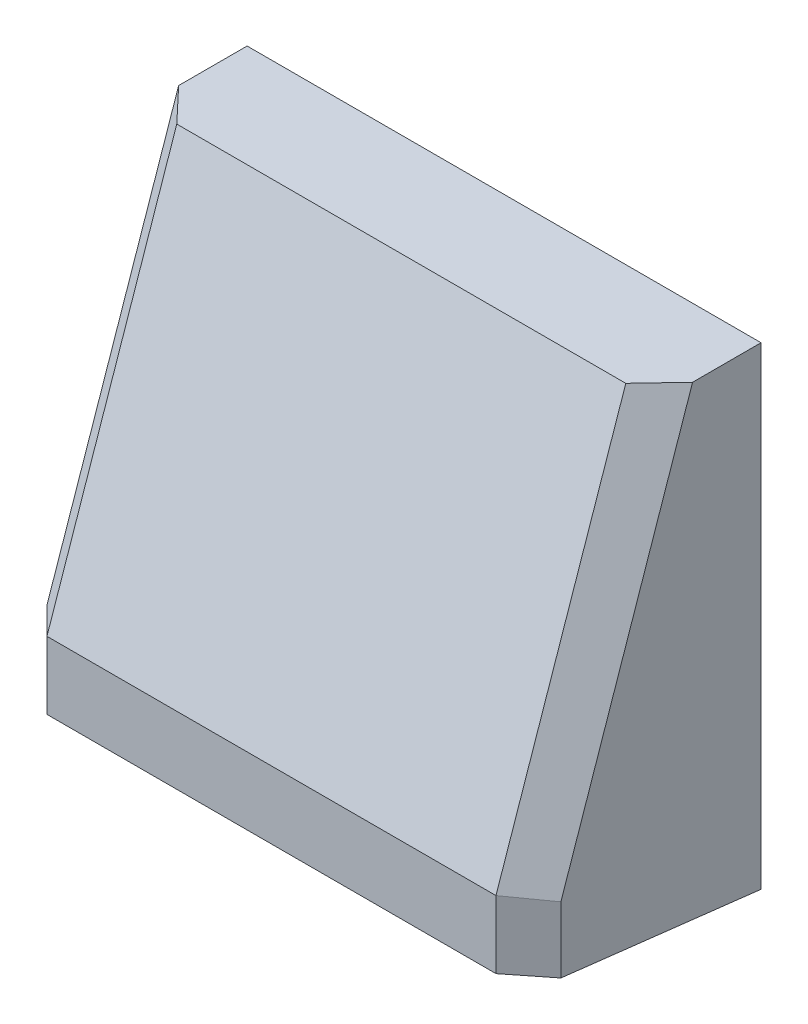
ISO-10303-21;
HEADER;
FILE_DESCRIPTION(('STEP AP214'),'2;1');
FILE_NAME('part.step','',(''),(''),'','','');
FILE_SCHEMA(('AUTOMOTIVE_DESIGN { 1 0 10303 214 1 1 1 1 }'));
ENDSEC;
DATA;
#1=APPLICATION_CONTEXT('core data for automotive mechanical design processes');
#2=APPLICATION_PROTOCOL_DEFINITION('international standard','automotive_design',2000,#1);
#3=PRODUCT_CONTEXT('',#1,'mechanical');
#4=PRODUCT('Part','Part','',(#3));
#5=PRODUCT_RELATED_PRODUCT_CATEGORY('part','',(#4));
#6=PRODUCT_DEFINITION_FORMATION('','',#4);
#7=PRODUCT_DEFINITION_CONTEXT('part definition',#1,'design');
#8=PRODUCT_DEFINITION('design','',#6,#7);
#9=PRODUCT_DEFINITION_SHAPE('','',#8);
#10=(LENGTH_UNIT() NAMED_UNIT(*) SI_UNIT(.MILLI.,.METRE.));
#11=(NAMED_UNIT(*) PLANE_ANGLE_UNIT() SI_UNIT($,.RADIAN.));
#12=(NAMED_UNIT(*) SI_UNIT($,.STERADIAN.) SOLID_ANGLE_UNIT());
#13=UNCERTAINTY_MEASURE_WITH_UNIT(LENGTH_MEASURE(1.E-05),#10,'distance_accuracy_value','');
#14=(GEOMETRIC_REPRESENTATION_CONTEXT(3) GLOBAL_UNCERTAINTY_ASSIGNED_CONTEXT((#13)) GLOBAL_UNIT_ASSIGNED_CONTEXT((#10,
#11,#12)) REPRESENTATION_CONTEXT('',''));
#15=CARTESIAN_POINT('',(0.,0.,0.));
#16=DIRECTION('',(0.,0.,1.));
#17=DIRECTION('',(1.,0.,0.));
#18=AXIS2_PLACEMENT_3D('',#15,#16,#17);
#19=CARTESIAN_POINT('',(-95.,35.,108.));
#20=DIRECTION('',(0.,-0.993307380301254,0.115500858174564));
#21=DIRECTION('',(0.,-0.115500858174564,-0.993307380301254));
#22=AXIS2_PLACEMENT_3D('',#19,#20,#21);
#23=PLANE('',#22);
#24=DIRECTION('',(0.,-0.115500858174564,-0.993307380301253));
#25=VECTOR('',#24,1.);
#26=CARTESIAN_POINT('',(95.,35.,108.));
#27=LINE('',#26,#25);
#28=CARTESIAN_POINT('',(95.,33.6046511627907,96.));
#29=VERTEX_POINT('',#28);
#30=CARTESIAN_POINT('',(95.,25.,22.));
#31=VERTEX_POINT('',#30);
#32=EDGE_CURVE('E179',#29,#31,#27,.T.);
#33=ORIENTED_EDGE('',*,*,#32,.F.);
#34=DIRECTION('',(0.704728665951292,-0.0819451937152659,-0.704728665951287));
#35=VECTOR('',#34,1.);
#36=CARTESIAN_POINT('',(-5.40236368520074,45.2793446145582,196.4023636852));
#37=LINE('',#36,#35);
#38=CARTESIAN_POINT('',(83.,35.,108.));
#39=VERTEX_POINT('',#38);
#40=EDGE_CURVE('E231',#29,#39,#37,.F.);
#41=ORIENTED_EDGE('',*,*,#40,.T.);
#42=DIRECTION('',(1.,0.,0.));
#43=VECTOR('',#42,1.);
#44=CARTESIAN_POINT('',(-95.,35.,108.));
#45=LINE('',#44,#43);
#46=CARTESIAN_POINT('',(-83.,35.,108.));
#47=VERTEX_POINT('',#46);
#48=EDGE_CURVE('E197',#47,#39,#45,.T.);
#49=ORIENTED_EDGE('',*,*,#48,.F.);
#50=DIRECTION('',(-0.704728665951287,-0.0819451937152665,-0.704728665951292));
#51=VECTOR('',#50,1.);
#52=CARTESIAN_POINT('',(-88.9597099113618,34.3070104754231,102.040290088638));
#53=LINE('',#52,#51);
#54=CARTESIAN_POINT('',(-95.,33.6046511627907,96.));
#55=VERTEX_POINT('',#54);
#56=EDGE_CURVE('E63',#47,#55,#53,.T.);
#57=ORIENTED_EDGE('',*,*,#56,.T.);
#58=DIRECTION('',(0.,-0.115500858174564,-0.993307380301253));
#59=VECTOR('',#58,1.);
#60=CARTESIAN_POINT('',(-95.,35.,108.));
#61=LINE('',#60,#59);
#62=CARTESIAN_POINT('',(-95.,25.,22.));
#63=VERTEX_POINT('',#62);
#64=EDGE_CURVE('E189',#55,#63,#61,.T.);
#65=ORIENTED_EDGE('',*,*,#64,.T.);
#66=DIRECTION('',(1.,0.,0.));
#67=VECTOR('',#66,1.);
#68=CARTESIAN_POINT('',(-95.,25.,22.));
#69=LINE('',#68,#67);
#70=CARTESIAN_POINT('',(-80.,25.,22.));
#71=VERTEX_POINT('',#70);
#72=EDGE_CURVE('E208',#63,#71,#69,.T.);
#73=ORIENTED_EDGE('',*,*,#72,.T.);
#74=DIRECTION('',(0.,0.115500858174564,0.993307380301254));
#75=VECTOR('',#74,1.);
#76=CARTESIAN_POINT('',(-80.,35.,108.));
#77=LINE('',#76,#75);
#78=CARTESIAN_POINT('',(-80.,33.6046511627907,96.));
#79=VERTEX_POINT('',#78);
#80=EDGE_CURVE('E158',#71,#79,#77,.T.);
#81=ORIENTED_EDGE('',*,*,#80,.T.);
#82=DIRECTION('',(-1.,0.,0.));
#83=VECTOR('',#82,1.);
#84=CARTESIAN_POINT('',(80.,33.6046511627907,96.));
#85=LINE('',#84,#83);
#86=CARTESIAN_POINT('',(80.,33.6046511627907,96.));
#87=VERTEX_POINT('',#86);
#88=EDGE_CURVE('E174',#87,#79,#85,.T.);
#89=ORIENTED_EDGE('',*,*,#88,.F.);
#90=DIRECTION('',(0.,0.115500858174564,0.993307380301254));
#91=VECTOR('',#90,1.);
#92=CARTESIAN_POINT('',(80.,35.,108.));
#93=LINE('',#92,#91);
#94=CARTESIAN_POINT('',(80.,25.,22.));
#95=VERTEX_POINT('',#94);
#96=EDGE_CURVE('E178',#95,#87,#93,.T.);
#97=ORIENTED_EDGE('',*,*,#96,.F.);
#98=EDGE_CURVE('E198',#95,#31,#69,.T.);
#99=ORIENTED_EDGE('',*,*,#98,.T.);
#100=EDGE_LOOP('',(#33,#41,#49,#57,#65,#73,#81,#89,#97,#99));
#101=FACE_BOUND('',#100,.T.);
#102=ADVANCED_FACE('F41',(#101),#23,.T.);
#103=CARTESIAN_POINT('',(-95.,60.,108.));
#104=DIRECTION('',(0.,0.,1.));
#105=DIRECTION('',(1.,0.,0.));
#106=AXIS2_PLACEMENT_3D('',#103,#104,#105);
#107=PLANE('',#106);
#108=ORIENTED_EDGE('',*,*,#48,.T.);
#109=DIRECTION('',(0.,1.,0.));
#110=VECTOR('',#109,1.);
#111=CARTESIAN_POINT('',(83.,60.,108.));
#112=LINE('',#111,#110);
#113=CARTESIAN_POINT('',(83.,60.,108.));
#114=VERTEX_POINT('',#113);
#115=EDGE_CURVE('E234',#39,#114,#112,.T.);
#116=ORIENTED_EDGE('',*,*,#115,.T.);
#117=DIRECTION('',(1.,0.,0.));
#118=VECTOR('',#117,1.);
#119=CARTESIAN_POINT('',(-95.,60.,108.));
#120=LINE('',#119,#118);
#121=CARTESIAN_POINT('',(-83.,60.,108.));
#122=VERTEX_POINT('',#121);
#123=EDGE_CURVE('E199',#122,#114,#120,.T.);
#124=ORIENTED_EDGE('',*,*,#123,.F.);
#125=DIRECTION('',(0.,-1.,0.));
#126=VECTOR('',#125,1.);
#127=CARTESIAN_POINT('',(-83.,35.,108.));
#128=LINE('',#127,#126);
#129=EDGE_CURVE('E233',#122,#47,#128,.T.);
#130=ORIENTED_EDGE('',*,*,#129,.T.);
#131=EDGE_LOOP('',(#108,#116,#124,#130));
#132=FACE_BOUND('',#131,.T.);
#133=ADVANCED_FACE('F255',(#132),#107,.T.);
#134=CARTESIAN_POINT('',(-95.,200.,60.));
#135=DIRECTION('',(0.,0.324324324324324,0.945945945945946));
#136=DIRECTION('',(0.,-0.945945945945946,0.324324324324324));
#137=AXIS2_PLACEMENT_3D('',#134,#135,#136);
#138=PLANE('',#137);
#139=ORIENTED_EDGE('',*,*,#123,.T.);
#140=DIRECTION('',(0.,0.945945945945946,-0.324324324324324));
#141=VECTOR('',#140,1.);
#142=CARTESIAN_POINT('',(83.,200.,60.));
#143=LINE('',#142,#141);
#144=CARTESIAN_POINT('',(83.,200.,60.));
#145=VERTEX_POINT('',#144);
#146=EDGE_CURVE('E221',#114,#145,#143,.T.);
#147=ORIENTED_EDGE('',*,*,#146,.T.);
#148=DIRECTION('',(1.,0.,0.));
#149=VECTOR('',#148,1.);
#150=CARTESIAN_POINT('',(-95.,200.,60.));
#151=LINE('',#150,#149);
#152=CARTESIAN_POINT('',(-83.,200.,60.));
#153=VERTEX_POINT('',#152);
#154=EDGE_CURVE('E201',#153,#145,#151,.T.);
#155=ORIENTED_EDGE('',*,*,#154,.F.);
#156=DIRECTION('',(0.,-0.945945945945946,0.324324324324324));
#157=VECTOR('',#156,1.);
#158=CARTESIAN_POINT('',(-83.,60.,108.));
#159=LINE('',#158,#157);
#160=EDGE_CURVE('E222',#153,#122,#159,.T.);
#161=ORIENTED_EDGE('',*,*,#160,.T.);
#162=EDGE_LOOP('',(#139,#147,#155,#161));
#163=FACE_BOUND('',#162,.T.);
#164=ADVANCED_FACE('F251',(#163),#138,.T.);
#165=CARTESIAN_POINT('',(-95.,200.,22.));
#166=DIRECTION('',(0.,1.,0.));
#167=DIRECTION('',(0.,0.,1.));
#168=AXIS2_PLACEMENT_3D('',#165,#166,#167);
#169=PLANE('',#168);
#170=ORIENTED_EDGE('',*,*,#154,.T.);
#171=DIRECTION('',(-0.687199853876086,0.,0.726468416954713));
#172=VECTOR('',#171,1.);
#173=CARTESIAN_POINT('',(17.9113338473393,200.,128.808018504241));
#174=LINE('',#173,#172);
#175=CARTESIAN_POINT('',(95.,200.,47.3142857142858));
#176=VERTEX_POINT('',#175);
#177=EDGE_CURVE('E229',#145,#176,#174,.F.);
#178=ORIENTED_EDGE('',*,*,#177,.T.);
#179=DIRECTION('',(0.,0.,1.));
#180=VECTOR('',#179,1.);
#181=CARTESIAN_POINT('',(95.,200.,22.));
#182=LINE('',#181,#180);
#183=CARTESIAN_POINT('',(95.,200.,22.));
#184=VERTEX_POINT('',#183);
#185=EDGE_CURVE('E183',#184,#176,#182,.T.);
#186=ORIENTED_EDGE('',*,*,#185,.F.);
#187=DIRECTION('',(1.,0.,0.));
#188=VECTOR('',#187,1.);
#189=CARTESIAN_POINT('',(-95.,200.,22.));
#190=LINE('',#189,#188);
#191=CARTESIAN_POINT('',(-95.,200.,22.));
#192=VERTEX_POINT('',#191);
#193=EDGE_CURVE('E206',#192,#184,#190,.T.);
#194=ORIENTED_EDGE('',*,*,#193,.F.);
#195=DIRECTION('',(0.,0.,1.));
#196=VECTOR('',#195,1.);
#197=CARTESIAN_POINT('',(-95.,200.,22.));
#198=LINE('',#197,#196);
#199=CARTESIAN_POINT('',(-95.,200.,47.3142857142857));
#200=VERTEX_POINT('',#199);
#201=EDGE_CURVE('E193',#192,#200,#198,.T.);
#202=ORIENTED_EDGE('',*,*,#201,.T.);
#203=DIRECTION('',(0.68719985387608,0.,0.726468416954718));
#204=VECTOR('',#203,1.);
#205=CARTESIAN_POINT('',(-107.637625289129,200.,33.9545104086352));
#206=LINE('',#205,#204);
#207=EDGE_CURVE('E227',#200,#153,#206,.T.);
#208=ORIENTED_EDGE('',*,*,#207,.T.);
#209=EDGE_LOOP('',(#170,#178,#186,#194,#202,#208));
#210=FACE_BOUND('',#209,.T.);
#211=ADVANCED_FACE('F266',(#210),#169,.T.);
#212=CARTESIAN_POINT('',(-95.,25.,22.));
#213=DIRECTION('',(0.,0.,-1.));
#214=DIRECTION('',(-1.,0.,0.));
#215=AXIS2_PLACEMENT_3D('',#212,#213,#214);
#216=PLANE('',#215);
#217=DIRECTION('',(0.,-1.,0.));
#218=VECTOR('',#217,1.);
#219=CARTESIAN_POINT('',(80.,25.,22.));
#220=LINE('',#219,#218);
#221=CARTESIAN_POINT('',(80.,193.,22.));
#222=VERTEX_POINT('',#221);
#223=EDGE_CURVE('E212',#222,#95,#220,.T.);
#224=ORIENTED_EDGE('',*,*,#223,.F.);
#225=DIRECTION('',(-1.,0.,0.));
#226=VECTOR('',#225,1.);
#227=CARTESIAN_POINT('',(-95.,193.,22.));
#228=LINE('',#227,#226);
#229=CARTESIAN_POINT('',(-80.,193.,22.));
#230=VERTEX_POINT('',#229);
#231=EDGE_CURVE('E215',#222,#230,#228,.T.);
#232=ORIENTED_EDGE('',*,*,#231,.T.);
#233=DIRECTION('',(0.,-1.,0.));
#234=VECTOR('',#233,1.);
#235=CARTESIAN_POINT('',(-80.,25.,22.));
#236=LINE('',#235,#234);
#237=EDGE_CURVE('E148',#230,#71,#236,.T.);
#238=ORIENTED_EDGE('',*,*,#237,.T.);
#239=ORIENTED_EDGE('',*,*,#72,.F.);
#240=DIRECTION('',(0.,1.,0.));
#241=VECTOR('',#240,1.);
#242=CARTESIAN_POINT('',(-95.,25.,22.));
#243=LINE('',#242,#241);
#244=EDGE_CURVE('E188',#63,#192,#243,.T.);
#245=ORIENTED_EDGE('',*,*,#244,.T.);
#246=ORIENTED_EDGE('',*,*,#193,.T.);
#247=DIRECTION('',(0.,1.,0.));
#248=VECTOR('',#247,1.);
#249=CARTESIAN_POINT('',(95.,25.,22.));
#250=LINE('',#249,#248);
#251=EDGE_CURVE('E185',#31,#184,#250,.T.);
#252=ORIENTED_EDGE('',*,*,#251,.F.);
#253=ORIENTED_EDGE('',*,*,#98,.F.);
#254=EDGE_LOOP('',(#224,#232,#238,#239,#245,#246,#252,#253));
#255=FACE_BOUND('',#254,.T.);
#256=ADVANCED_FACE('F272',(#255),#216,.T.);
#257=CARTESIAN_POINT('',(-95.,0.,0.));
#258=DIRECTION('',(1.,0.,0.));
#259=DIRECTION('',(0.,0.,-1.));
#260=AXIS2_PLACEMENT_3D('',#257,#258,#259);
#261=PLANE('',#260);
#262=DIRECTION('',(0.,1.,0.));
#263=VECTOR('',#262,1.);
#264=CARTESIAN_POINT('',(-95.,60.,96.));
#265=LINE('',#264,#263);
#266=CARTESIAN_POINT('',(-95.,58.,96.));
#267=VERTEX_POINT('',#266);
#268=EDGE_CURVE('E51',#55,#267,#265,.T.);
#269=ORIENTED_EDGE('',*,*,#268,.T.);
#270=DIRECTION('',(0.,0.945945945945946,-0.324324324324324));
#271=VECTOR('',#270,1.);
#272=CARTESIAN_POINT('',(-95.,196.108108108108,48.6486486486486));
#273=LINE('',#272,#271);
#274=EDGE_CURVE('E11',#267,#200,#273,.T.);
#275=ORIENTED_EDGE('',*,*,#274,.T.);
#276=ORIENTED_EDGE('',*,*,#201,.F.);
#277=ORIENTED_EDGE('',*,*,#244,.F.);
#278=ORIENTED_EDGE('',*,*,#64,.F.);
#279=EDGE_LOOP('',(#269,#275,#276,#277,#278));
#280=FACE_BOUND('',#279,.T.);
#281=ADVANCED_FACE('F267',(#280),#261,.F.);
#282=CARTESIAN_POINT('',(95.,0.,0.));
#283=DIRECTION('',(1.,0.,0.));
#284=DIRECTION('',(0.,0.,-1.));
#285=AXIS2_PLACEMENT_3D('',#282,#283,#284);
#286=PLANE('',#285);
#287=ORIENTED_EDGE('',*,*,#185,.T.);
#288=DIRECTION('',(0.,-0.945945945945946,0.324324324324324));
#289=VECTOR('',#288,1.);
#290=CARTESIAN_POINT('',(95.,35.5529583637692,103.696128560993));
#291=LINE('',#290,#289);
#292=CARTESIAN_POINT('',(95.,58.0000000000001,96.));
#293=VERTEX_POINT('',#292);
#294=EDGE_CURVE('E217',#176,#293,#291,.T.);
#295=ORIENTED_EDGE('',*,*,#294,.T.);
#296=DIRECTION('',(0.,-1.,0.));
#297=VECTOR('',#296,1.);
#298=CARTESIAN_POINT('',(95.,0.,96.));
#299=LINE('',#298,#297);
#300=EDGE_CURVE('E216',#293,#29,#299,.T.);
#301=ORIENTED_EDGE('',*,*,#300,.T.);
#302=ORIENTED_EDGE('',*,*,#32,.T.);
#303=ORIENTED_EDGE('',*,*,#251,.T.);
#304=EDGE_LOOP('',(#287,#295,#301,#302,#303));
#305=FACE_BOUND('',#304,.T.);
#306=ADVANCED_FACE('F261',(#305),#286,.T.);
#307=CARTESIAN_POINT('',(80.,193.,18.));
#308=DIRECTION('',(0.,-1.,0.));
#309=DIRECTION('',(0.,0.,-1.));
#310=AXIS2_PLACEMENT_3D('',#307,#308,#309);
#311=PLANE('',#310);
#312=DIRECTION('',(0.,0.,1.));
#313=VECTOR('',#312,1.);
#314=CARTESIAN_POINT('',(80.,193.,18.));
#315=LINE('',#314,#313);
#316=CARTESIAN_POINT('',(80.,193.,48.));
#317=VERTEX_POINT('',#316);
#318=EDGE_CURVE('E154',#222,#317,#315,.T.);
#319=ORIENTED_EDGE('',*,*,#318,.T.);
#320=DIRECTION('',(-1.,0.,0.));
#321=VECTOR('',#320,1.);
#322=CARTESIAN_POINT('',(80.,193.,48.));
#323=LINE('',#322,#321);
#324=CARTESIAN_POINT('',(-80.,193.,48.));
#325=VERTEX_POINT('',#324);
#326=EDGE_CURVE('E155',#317,#325,#323,.T.);
#327=ORIENTED_EDGE('',*,*,#326,.T.);
#328=DIRECTION('',(0.,0.,1.));
#329=VECTOR('',#328,1.);
#330=CARTESIAN_POINT('',(-80.,193.,18.));
#331=LINE('',#330,#329);
#332=EDGE_CURVE('E138',#230,#325,#331,.T.);
#333=ORIENTED_EDGE('',*,*,#332,.F.);
#334=ORIENTED_EDGE('',*,*,#231,.F.);
#335=EDGE_LOOP('',(#319,#327,#333,#334));
#336=FACE_BOUND('',#335,.T.);
#337=ADVANCED_FACE('F153',(#336),#311,.T.);
#338=CARTESIAN_POINT('',(80.,193.,48.));
#339=DIRECTION('',(0.,-0.339470667535416,-0.940616641296048));
#340=DIRECTION('',(0.,0.940616641296049,-0.339470667535416));
#341=AXIS2_PLACEMENT_3D('',#338,#339,#340);
#342=PLANE('',#341);
#343=ORIENTED_EDGE('',*,*,#326,.F.);
#344=DIRECTION('',(0.,-0.940616641296048,0.339470667535416));
#345=VECTOR('',#344,1.);
#346=CARTESIAN_POINT('',(80.,193.,48.));
#347=LINE('',#346,#345);
#348=CARTESIAN_POINT('',(80.,60.,96.));
#349=VERTEX_POINT('',#348);
#350=EDGE_CURVE('E169',#317,#349,#347,.T.);
#351=ORIENTED_EDGE('',*,*,#350,.T.);
#352=DIRECTION('',(-1.,0.,0.));
#353=VECTOR('',#352,1.);
#354=CARTESIAN_POINT('',(80.,60.,96.));
#355=LINE('',#354,#353);
#356=CARTESIAN_POINT('',(-80.,60.,96.));
#357=VERTEX_POINT('',#356);
#358=EDGE_CURVE('E157',#349,#357,#355,.T.);
#359=ORIENTED_EDGE('',*,*,#358,.T.);
#360=DIRECTION('',(0.,-0.940616641296048,0.339470667535416));
#361=VECTOR('',#360,1.);
#362=CARTESIAN_POINT('',(-80.,193.,48.));
#363=LINE('',#362,#361);
#364=EDGE_CURVE('E141',#325,#357,#363,.T.);
#365=ORIENTED_EDGE('',*,*,#364,.F.);
#366=EDGE_LOOP('',(#343,#351,#359,#365));
#367=FACE_BOUND('',#366,.T.);
#368=ADVANCED_FACE('F161',(#367),#342,.T.);
#369=CARTESIAN_POINT('',(80.,60.,96.));
#370=DIRECTION('',(0.,0.,-1.));
#371=DIRECTION('',(-1.,0.,0.));
#372=AXIS2_PLACEMENT_3D('',#369,#370,#371);
#373=PLANE('',#372);
#374=ORIENTED_EDGE('',*,*,#358,.F.);
#375=DIRECTION('',(0.,-1.,0.));
#376=VECTOR('',#375,1.);
#377=CARTESIAN_POINT('',(80.,60.,96.));
#378=LINE('',#377,#376);
#379=EDGE_CURVE('E168',#349,#87,#378,.T.);
#380=ORIENTED_EDGE('',*,*,#379,.T.);
#381=ORIENTED_EDGE('',*,*,#88,.T.);
#382=DIRECTION('',(0.,-1.,0.));
#383=VECTOR('',#382,1.);
#384=CARTESIAN_POINT('',(-80.,60.,96.));
#385=LINE('',#384,#383);
#386=EDGE_CURVE('E162',#357,#79,#385,.T.);
#387=ORIENTED_EDGE('',*,*,#386,.F.);
#388=EDGE_LOOP('',(#374,#380,#381,#387));
#389=FACE_BOUND('',#388,.T.);
#390=ADVANCED_FACE('F279',(#389),#373,.T.);
#391=CARTESIAN_POINT('',(80.,0.,0.));
#392=DIRECTION('',(1.,0.,0.));
#393=DIRECTION('',(0.,0.,-1.));
#394=AXIS2_PLACEMENT_3D('',#391,#392,#393);
#395=PLANE('',#394);
#396=ORIENTED_EDGE('',*,*,#96,.T.);
#397=ORIENTED_EDGE('',*,*,#379,.F.);
#398=ORIENTED_EDGE('',*,*,#350,.F.);
#399=ORIENTED_EDGE('',*,*,#318,.F.);
#400=ORIENTED_EDGE('',*,*,#223,.T.);
#401=EDGE_LOOP('',(#396,#397,#398,#399,#400));
#402=FACE_BOUND('',#401,.T.);
#403=ADVANCED_FACE('F282',(#402),#395,.F.);
#404=CARTESIAN_POINT('',(-80.,0.,0.));
#405=DIRECTION('',(1.,0.,0.));
#406=DIRECTION('',(0.,0.,-1.));
#407=AXIS2_PLACEMENT_3D('',#404,#405,#406);
#408=PLANE('',#407);
#409=ORIENTED_EDGE('',*,*,#237,.F.);
#410=ORIENTED_EDGE('',*,*,#332,.T.);
#411=ORIENTED_EDGE('',*,*,#364,.T.);
#412=ORIENTED_EDGE('',*,*,#386,.T.);
#413=ORIENTED_EDGE('',*,*,#80,.F.);
#414=EDGE_LOOP('',(#409,#410,#411,#412,#413));
#415=FACE_BOUND('',#414,.T.);
#416=ADVANCED_FACE('F139',(#415),#408,.T.);
#417=CARTESIAN_POINT('',(95.,0.,96.));
#418=DIRECTION('',(-0.707106781186545,0.,-0.70710678118655));
#419=DIRECTION('',(0.,-1.,0.));
#420=AXIS2_PLACEMENT_3D('',#417,#418,#419);
#421=PLANE('',#420);
#422=ORIENTED_EDGE('',*,*,#40,.F.);
#423=ORIENTED_EDGE('',*,*,#300,.F.);
#424=DIRECTION('',(-0.702246883176786,0.117041147196128,0.702246883176781));
#425=VECTOR('',#424,1.);
#426=CARTESIAN_POINT('',(99.7671232876712,57.2054794520549,91.2328767123289));
#427=LINE('',#426,#425);
#428=EDGE_CURVE('E149',#114,#293,#427,.F.);
#429=ORIENTED_EDGE('',*,*,#428,.F.);
#430=ORIENTED_EDGE('',*,*,#115,.F.);
#431=EDGE_LOOP('',(#422,#423,#429,#430));
#432=FACE_BOUND('',#431,.T.);
#433=ADVANCED_FACE('F256',(#432),#421,.F.);
#434=CARTESIAN_POINT('',(95.,35.5529583637692,103.696128560993));
#435=DIRECTION('',(-0.707106781186545,-0.229331929033476,-0.668884793014304));
#436=DIRECTION('',(0.,-0.945945945945946,0.324324324324324));
#437=AXIS2_PLACEMENT_3D('',#434,#435,#436);
#438=PLANE('',#437);
#439=ORIENTED_EDGE('',*,*,#177,.F.);
#440=ORIENTED_EDGE('',*,*,#146,.F.);
#441=ORIENTED_EDGE('',*,*,#428,.T.);
#442=ORIENTED_EDGE('',*,*,#294,.F.);
#443=EDGE_LOOP('',(#439,#440,#441,#442));
#444=FACE_BOUND('',#443,.T.);
#445=ADVANCED_FACE('F262',(#444),#438,.F.);
#446=CARTESIAN_POINT('',(-83.,60.,108.));
#447=DIRECTION('',(-0.70710678118655,0.,0.707106781186545));
#448=DIRECTION('',(0.,1.,0.));
#449=AXIS2_PLACEMENT_3D('',#446,#447,#448);
#450=PLANE('',#449);
#451=ORIENTED_EDGE('',*,*,#56,.F.);
#452=ORIENTED_EDGE('',*,*,#129,.F.);
#453=DIRECTION('',(-0.702246883176781,-0.117041147196133,-0.702246883176786));
#454=VECTOR('',#453,1.);
#455=CARTESIAN_POINT('',(-83.,60.,108.));
#456=LINE('',#455,#454);
#457=EDGE_CURVE('E46',#267,#122,#456,.F.);
#458=ORIENTED_EDGE('',*,*,#457,.F.);
#459=ORIENTED_EDGE('',*,*,#268,.F.);
#460=EDGE_LOOP('',(#451,#452,#458,#459));
#461=FACE_BOUND('',#460,.T.);
#462=ADVANCED_FACE('F42',(#461),#450,.T.);
#463=CARTESIAN_POINT('',(-83.,200.,60.));
#464=DIRECTION('',(-0.70710678118655,0.229331929033474,0.668884793014299));
#465=DIRECTION('',(0.,0.945945945945946,-0.324324324324324));
#466=AXIS2_PLACEMENT_3D('',#463,#464,#465);
#467=PLANE('',#466);
#468=ORIENTED_EDGE('',*,*,#207,.F.);
#469=ORIENTED_EDGE('',*,*,#274,.F.);
#470=ORIENTED_EDGE('',*,*,#457,.T.);
#471=ORIENTED_EDGE('',*,*,#160,.F.);
#472=EDGE_LOOP('',(#468,#469,#470,#471));
#473=FACE_BOUND('',#472,.T.);
#474=ADVANCED_FACE('F250',(#473),#467,.T.);
#475=CLOSED_SHELL('',(#102,#133,#164,#211,#256,#281,#306,#337,#368,#390,#403,#416,#433,#445,
#462,#474));
#476=MANIFOLD_SOLID_BREP('B2',#475);
#477=ADVANCED_BREP_SHAPE_REPRESENTATION('',(#18,#476),#14);
#478=SHAPE_DEFINITION_REPRESENTATION(#9,#477);
ENDSEC;
END-ISO-10303-21;
